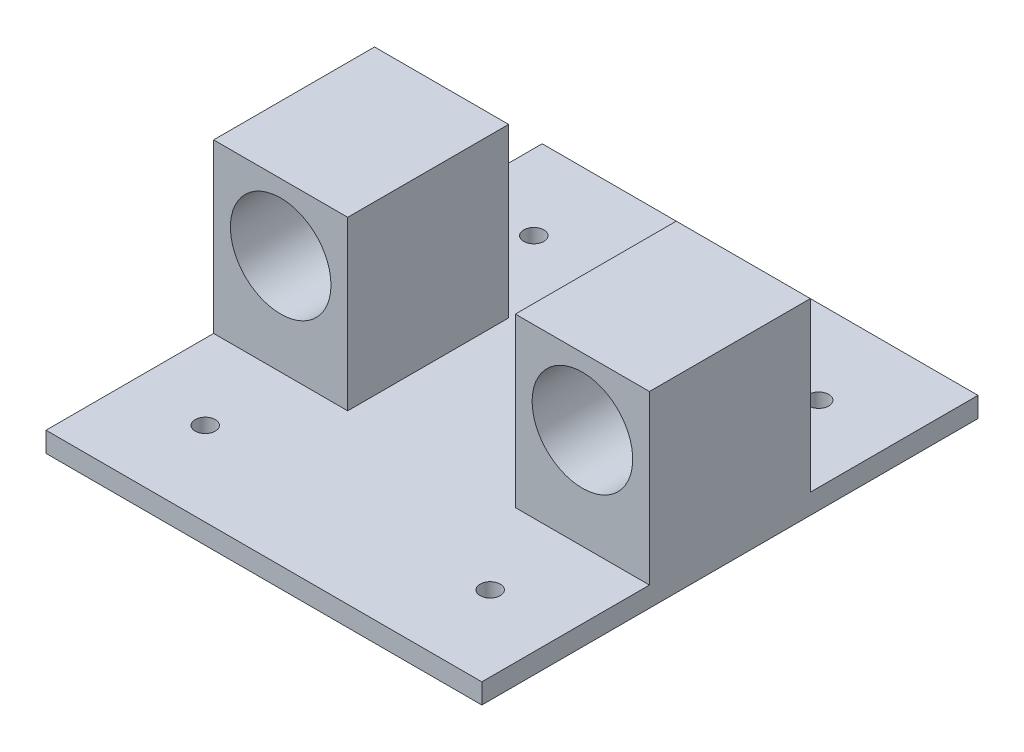
ISO-10303-21;
HEADER;
FILE_DESCRIPTION(('STEP AP214'),'2;1');
FILE_NAME('part.step','',(''),(''),'','','');
FILE_SCHEMA(('AUTOMOTIVE_DESIGN { 1 0 10303 214 1 1 1 1 }'));
ENDSEC;
DATA;
#1=APPLICATION_CONTEXT('core data for automotive mechanical design processes');
#2=APPLICATION_PROTOCOL_DEFINITION('international standard','automotive_design',2000,#1);
#3=PRODUCT_CONTEXT('',#1,'mechanical');
#4=PRODUCT('Part','Part','',(#3));
#5=PRODUCT_RELATED_PRODUCT_CATEGORY('part','',(#4));
#6=PRODUCT_DEFINITION_FORMATION('','',#4);
#7=PRODUCT_DEFINITION_CONTEXT('part definition',#1,'design');
#8=PRODUCT_DEFINITION('design','',#6,#7);
#9=PRODUCT_DEFINITION_SHAPE('','',#8);
#10=(LENGTH_UNIT() NAMED_UNIT(*) SI_UNIT(.MILLI.,.METRE.));
#11=(NAMED_UNIT(*) PLANE_ANGLE_UNIT() SI_UNIT($,.RADIAN.));
#12=(NAMED_UNIT(*) SI_UNIT($,.STERADIAN.) SOLID_ANGLE_UNIT());
#13=UNCERTAINTY_MEASURE_WITH_UNIT(LENGTH_MEASURE(1.E-05),#10,'distance_accuracy_value','');
#14=(GEOMETRIC_REPRESENTATION_CONTEXT(3) GLOBAL_UNCERTAINTY_ASSIGNED_CONTEXT((#13)) GLOBAL_UNIT_ASSIGNED_CONTEXT((#10,
#11,#12)) REPRESENTATION_CONTEXT('',''));
#15=CARTESIAN_POINT('',(0.,0.,0.));
#16=DIRECTION('',(0.,0.,1.));
#17=DIRECTION('',(1.,0.,0.));
#18=AXIS2_PLACEMENT_3D('',#15,#16,#17);
#19=CARTESIAN_POINT('',(0.,0.,-12.));
#20=DIRECTION('',(0.,0.,1.));
#21=DIRECTION('',(1.,0.,0.));
#22=AXIS2_PLACEMENT_3D('',#19,#20,#21);
#23=PLANE('',#22);
#24=CARTESIAN_POINT('',(22.5,18.,-12.));
#25=DIRECTION('',(0.,0.,-1.));
#26=DIRECTION('',(-1.,0.,0.));
#27=AXIS2_PLACEMENT_3D('',#24,#25,#26);
#28=CIRCLE('',#27,7.5);
#29=CARTESIAN_POINT('',(15.,18.,-12.));
#30=VERTEX_POINT('',#29);
#31=EDGE_CURVE('E208',#30,#30,#28,.T.);
#32=ORIENTED_EDGE('',*,*,#31,.F.);
#33=EDGE_LOOP('',(#32));
#34=FACE_BOUND('',#33,.T.);
#35=DIRECTION('',(0.,1.,0.));
#36=VECTOR('',#35,1.);
#37=CARTESIAN_POINT('',(32.5,0.,-12.));
#38=LINE('',#37,#36);
#39=CARTESIAN_POINT('',(32.5,3.,-12.));
#40=VERTEX_POINT('',#39);
#41=CARTESIAN_POINT('',(32.5,28.,-12.));
#42=VERTEX_POINT('',#41);
#43=EDGE_CURVE('E255',#40,#42,#38,.T.);
#44=ORIENTED_EDGE('',*,*,#43,.F.);
#45=DIRECTION('',(-1.,0.,0.));
#46=VECTOR('',#45,1.);
#47=CARTESIAN_POINT('',(32.5,3.,-12.));
#48=LINE('',#47,#46);
#49=CARTESIAN_POINT('',(12.5,3.,-12.));
#50=VERTEX_POINT('',#49);
#51=EDGE_CURVE('E51',#40,#50,#48,.T.);
#52=ORIENTED_EDGE('',*,*,#51,.T.);
#53=DIRECTION('',(0.,-1.,0.));
#54=VECTOR('',#53,1.);
#55=CARTESIAN_POINT('',(12.5,28.,-12.));
#56=LINE('',#55,#54);
#57=CARTESIAN_POINT('',(12.5,28.,-12.));
#58=VERTEX_POINT('',#57);
#59=EDGE_CURVE('E220',#58,#50,#56,.T.);
#60=ORIENTED_EDGE('',*,*,#59,.F.);
#61=DIRECTION('',(-1.,0.,0.));
#62=VECTOR('',#61,1.);
#63=CARTESIAN_POINT('',(32.5,28.,-12.));
#64=LINE('',#63,#62);
#65=EDGE_CURVE('E228',#42,#58,#64,.T.);
#66=ORIENTED_EDGE('',*,*,#65,.F.);
#67=EDGE_LOOP('',(#44,#52,#60,#66));
#68=FACE_BOUND('',#67,.T.);
#69=ADVANCED_FACE('F39',(#34,#68),#23,.F.);
#70=CARTESIAN_POINT('',(0.,0.,12.));
#71=DIRECTION('',(0.,0.,1.));
#72=DIRECTION('',(1.,0.,0.));
#73=AXIS2_PLACEMENT_3D('',#70,#71,#72);
#74=PLANE('',#73);
#75=DIRECTION('',(-1.,0.,0.));
#76=VECTOR('',#75,1.);
#77=CARTESIAN_POINT('',(32.5,3.,12.));
#78=LINE('',#77,#76);
#79=CARTESIAN_POINT('',(32.5,3.,12.));
#80=VERTEX_POINT('',#79);
#81=CARTESIAN_POINT('',(12.5,2.99999999999999,12.));
#82=VERTEX_POINT('',#81);
#83=EDGE_CURVE('E65',#80,#82,#78,.T.);
#84=ORIENTED_EDGE('',*,*,#83,.F.);
#85=DIRECTION('',(0.,1.,0.));
#86=VECTOR('',#85,1.);
#87=CARTESIAN_POINT('',(32.5,0.,12.));
#88=LINE('',#87,#86);
#89=CARTESIAN_POINT('',(32.5,28.,12.));
#90=VERTEX_POINT('',#89);
#91=EDGE_CURVE('E237',#80,#90,#88,.T.);
#92=ORIENTED_EDGE('',*,*,#91,.T.);
#93=DIRECTION('',(-1.,0.,0.));
#94=VECTOR('',#93,1.);
#95=CARTESIAN_POINT('',(32.5,28.,12.));
#96=LINE('',#95,#94);
#97=CARTESIAN_POINT('',(12.5,28.,12.));
#98=VERTEX_POINT('',#97);
#99=EDGE_CURVE('E240',#90,#98,#96,.T.);
#100=ORIENTED_EDGE('',*,*,#99,.T.);
#101=DIRECTION('',(0.,-1.,0.));
#102=VECTOR('',#101,1.);
#103=CARTESIAN_POINT('',(12.5,28.,12.));
#104=LINE('',#103,#102);
#105=EDGE_CURVE('E224',#98,#82,#104,.T.);
#106=ORIENTED_EDGE('',*,*,#105,.T.);
#107=EDGE_LOOP('',(#84,#92,#100,#106));
#108=FACE_BOUND('',#107,.T.);
#109=CARTESIAN_POINT('',(22.5,18.,12.));
#110=DIRECTION('',(0.,0.,-1.));
#111=DIRECTION('',(-1.,0.,0.));
#112=AXIS2_PLACEMENT_3D('',#109,#110,#111);
#113=CIRCLE('',#112,7.5);
#114=CARTESIAN_POINT('',(15.,18.,12.));
#115=VERTEX_POINT('',#114);
#116=EDGE_CURVE('E207',#115,#115,#113,.T.);
#117=ORIENTED_EDGE('',*,*,#116,.T.);
#118=EDGE_LOOP('',(#117));
#119=FACE_BOUND('',#118,.T.);
#120=ADVANCED_FACE('F304',(#108,#119),#74,.T.);
#121=CARTESIAN_POINT('',(12.5,28.,12.));
#122=DIRECTION('',(1.,0.,0.));
#123=DIRECTION('',(0.,1.,0.));
#124=AXIS2_PLACEMENT_3D('',#121,#122,#123);
#125=PLANE('',#124);
#126=ORIENTED_EDGE('',*,*,#59,.T.);
#127=DIRECTION('',(0.,0.,-1.));
#128=VECTOR('',#127,1.);
#129=CARTESIAN_POINT('',(12.5,2.99999999999999,12.));
#130=LINE('',#129,#128);
#131=EDGE_CURVE('E43',#82,#50,#130,.T.);
#132=ORIENTED_EDGE('',*,*,#131,.F.);
#133=ORIENTED_EDGE('',*,*,#105,.F.);
#134=DIRECTION('',(0.,0.,-1.));
#135=VECTOR('',#134,1.);
#136=CARTESIAN_POINT('',(12.5,28.,12.));
#137=LINE('',#136,#135);
#138=EDGE_CURVE('E243',#98,#58,#137,.T.);
#139=ORIENTED_EDGE('',*,*,#138,.T.);
#140=EDGE_LOOP('',(#126,#132,#133,#139));
#141=FACE_BOUND('',#140,.T.);
#142=ADVANCED_FACE('F41',(#141),#125,.F.);
#143=CARTESIAN_POINT('',(-12.5,2.99999999999999,12.));
#144=DIRECTION('',(0.,-1.,0.));
#145=DIRECTION('',(0.,0.,-1.));
#146=AXIS2_PLACEMENT_3D('',#143,#144,#145);
#147=PLANE('',#146);
#148=CARTESIAN_POINT('',(-21.25,2.99999999999999,-24.5));
#149=DIRECTION('',(0.,-1.,0.));
#150=DIRECTION('',(0.,0.,-1.));
#151=AXIS2_PLACEMENT_3D('',#148,#149,#150);
#152=CIRCLE('',#151,1.5);
#153=CARTESIAN_POINT('',(-21.25,3.,-23.));
#154=VERTEX_POINT('',#153);
#155=EDGE_CURVE('E165',#154,#154,#152,.F.);
#156=ORIENTED_EDGE('',*,*,#155,.F.);
#157=EDGE_LOOP('',(#156));
#158=FACE_BOUND('',#157,.T.);
#159=CARTESIAN_POINT('',(21.25,2.99999999999999,-24.5));
#160=DIRECTION('',(0.,-1.,0.));
#161=DIRECTION('',(0.,0.,-1.));
#162=AXIS2_PLACEMENT_3D('',#159,#160,#161);
#163=CIRCLE('',#162,1.5);
#164=CARTESIAN_POINT('',(21.25,3.,-23.));
#165=VERTEX_POINT('',#164);
#166=EDGE_CURVE('E378',#165,#165,#163,.F.);
#167=ORIENTED_EDGE('',*,*,#166,.F.);
#168=EDGE_LOOP('',(#167));
#169=FACE_BOUND('',#168,.T.);
#170=CARTESIAN_POINT('',(-21.25,2.99999999999999,24.5));
#171=DIRECTION('',(0.,-1.,0.));
#172=DIRECTION('',(0.,0.,-1.));
#173=AXIS2_PLACEMENT_3D('',#170,#171,#172);
#174=CIRCLE('',#173,1.5);
#175=CARTESIAN_POINT('',(-21.25,3.,26.));
#176=VERTEX_POINT('',#175);
#177=EDGE_CURVE('E179',#176,#176,#174,.T.);
#178=ORIENTED_EDGE('',*,*,#177,.T.);
#179=EDGE_LOOP('',(#178));
#180=FACE_BOUND('',#179,.T.);
#181=CARTESIAN_POINT('',(21.25,2.99999999999999,24.5));
#182=DIRECTION('',(0.,-1.,0.));
#183=DIRECTION('',(0.,0.,-1.));
#184=AXIS2_PLACEMENT_3D('',#181,#182,#183);
#185=CIRCLE('',#184,1.5);
#186=CARTESIAN_POINT('',(21.25,3.,26.));
#187=VERTEX_POINT('',#186);
#188=EDGE_CURVE('E172',#187,#187,#185,.T.);
#189=ORIENTED_EDGE('',*,*,#188,.T.);
#190=EDGE_LOOP('',(#189));
#191=FACE_BOUND('',#190,.T.);
#192=ORIENTED_EDGE('',*,*,#131,.T.);
#193=ORIENTED_EDGE('',*,*,#51,.F.);
#194=DIRECTION('',(0.,0.,1.));
#195=VECTOR('',#194,1.);
#196=CARTESIAN_POINT('',(32.5,3.,-37.));
#197=LINE('',#196,#195);
#198=CARTESIAN_POINT('',(32.5,3.,-37.));
#199=VERTEX_POINT('',#198);
#200=EDGE_CURVE('E140',#199,#40,#197,.T.);
#201=ORIENTED_EDGE('',*,*,#200,.F.);
#202=DIRECTION('',(-1.,0.,0.));
#203=VECTOR('',#202,1.);
#204=CARTESIAN_POINT('',(32.5,3.,-37.));
#205=LINE('',#204,#203);
#206=CARTESIAN_POINT('',(-32.5,2.99999999999999,-37.));
#207=VERTEX_POINT('',#206);
#208=EDGE_CURVE('E146',#199,#207,#205,.T.);
#209=ORIENTED_EDGE('',*,*,#208,.T.);
#210=DIRECTION('',(0.,0.,1.));
#211=VECTOR('',#210,1.);
#212=CARTESIAN_POINT('',(-32.5,2.99999999999999,-37.));
#213=LINE('',#212,#211);
#214=CARTESIAN_POINT('',(-32.5,3.,-12.));
#215=VERTEX_POINT('',#214);
#216=EDGE_CURVE('E58',#207,#215,#213,.T.);
#217=ORIENTED_EDGE('',*,*,#216,.T.);
#218=CARTESIAN_POINT('',(-12.5,2.99999999999999,-12.));
#219=VERTEX_POINT('',#218);
#220=EDGE_CURVE('E11',#219,#215,#48,.T.);
#221=ORIENTED_EDGE('',*,*,#220,.F.);
#222=DIRECTION('',(0.,0.,-1.));
#223=VECTOR('',#222,1.);
#224=CARTESIAN_POINT('',(-12.5,2.99999999999999,12.));
#225=LINE('',#224,#223);
#226=CARTESIAN_POINT('',(-12.5,2.99999999999999,12.));
#227=VERTEX_POINT('',#226);
#228=EDGE_CURVE('E279',#227,#219,#225,.T.);
#229=ORIENTED_EDGE('',*,*,#228,.F.);
#230=CARTESIAN_POINT('',(-32.5,2.99999999999999,12.));
#231=VERTEX_POINT('',#230);
#232=EDGE_CURVE('E49',#227,#231,#78,.T.);
#233=ORIENTED_EDGE('',*,*,#232,.T.);
#234=DIRECTION('',(0.,0.,-1.));
#235=VECTOR('',#234,1.);
#236=CARTESIAN_POINT('',(-32.5,2.99999999999999,37.));
#237=LINE('',#236,#235);
#238=CARTESIAN_POINT('',(-32.5,2.99999999999999,37.));
#239=VERTEX_POINT('',#238);
#240=EDGE_CURVE('E197',#239,#231,#237,.T.);
#241=ORIENTED_EDGE('',*,*,#240,.F.);
#242=DIRECTION('',(-1.,0.,0.));
#243=VECTOR('',#242,1.);
#244=CARTESIAN_POINT('',(32.5,3.,37.));
#245=LINE('',#244,#243);
#246=CARTESIAN_POINT('',(32.5,3.,37.));
#247=VERTEX_POINT('',#246);
#248=EDGE_CURVE('E194',#247,#239,#245,.T.);
#249=ORIENTED_EDGE('',*,*,#248,.F.);
#250=DIRECTION('',(0.,0.,-1.));
#251=VECTOR('',#250,1.);
#252=CARTESIAN_POINT('',(32.5,3.,37.));
#253=LINE('',#252,#251);
#254=EDGE_CURVE('E203',#247,#80,#253,.T.);
#255=ORIENTED_EDGE('',*,*,#254,.T.);
#256=ORIENTED_EDGE('',*,*,#83,.T.);
#257=EDGE_LOOP('',(#192,#193,#201,#209,#217,#221,#229,#233,#241,#249,#255,#256));
#258=FACE_BOUND('',#257,.T.);
#259=ADVANCED_FACE('F153',(#158,#169,#180,#191,#258),#147,.F.);
#260=CARTESIAN_POINT('',(-12.5,28.,12.));
#261=DIRECTION('',(-1.,0.,0.));
#262=DIRECTION('',(0.,-1.,0.));
#263=AXIS2_PLACEMENT_3D('',#260,#261,#262);
#264=PLANE('',#263);
#265=DIRECTION('',(0.,1.,0.));
#266=VECTOR('',#265,1.);
#267=CARTESIAN_POINT('',(-12.5,28.,-12.));
#268=LINE('',#267,#266);
#269=CARTESIAN_POINT('',(-12.5,28.,-12.));
#270=VERTEX_POINT('',#269);
#271=EDGE_CURVE('E247',#219,#270,#268,.T.);
#272=ORIENTED_EDGE('',*,*,#271,.T.);
#273=DIRECTION('',(0.,0.,-1.));
#274=VECTOR('',#273,1.);
#275=CARTESIAN_POINT('',(-12.5,28.,12.));
#276=LINE('',#275,#274);
#277=CARTESIAN_POINT('',(-12.5,28.,12.));
#278=VERTEX_POINT('',#277);
#279=EDGE_CURVE('E276',#278,#270,#276,.T.);
#280=ORIENTED_EDGE('',*,*,#279,.F.);
#281=DIRECTION('',(0.,1.,0.));
#282=VECTOR('',#281,1.);
#283=CARTESIAN_POINT('',(-12.5,28.,12.));
#284=LINE('',#283,#282);
#285=EDGE_CURVE('E227',#227,#278,#284,.T.);
#286=ORIENTED_EDGE('',*,*,#285,.F.);
#287=ORIENTED_EDGE('',*,*,#228,.T.);
#288=EDGE_LOOP('',(#272,#280,#286,#287));
#289=FACE_BOUND('',#288,.T.);
#290=ADVANCED_FACE('F354',(#289),#264,.F.);
#291=CARTESIAN_POINT('',(-32.5,28.,12.));
#292=DIRECTION('',(0.,-1.,0.));
#293=DIRECTION('',(0.,0.,-1.));
#294=AXIS2_PLACEMENT_3D('',#291,#292,#293);
#295=PLANE('',#294);
#296=DIRECTION('',(-1.,0.,0.));
#297=VECTOR('',#296,1.);
#298=CARTESIAN_POINT('',(-32.5,28.,-12.));
#299=LINE('',#298,#297);
#300=CARTESIAN_POINT('',(-32.5,28.,-12.));
#301=VERTEX_POINT('',#300);
#302=EDGE_CURVE('E250',#270,#301,#299,.T.);
#303=ORIENTED_EDGE('',*,*,#302,.T.);
#304=DIRECTION('',(0.,0.,-1.));
#305=VECTOR('',#304,1.);
#306=CARTESIAN_POINT('',(-32.5,28.,12.));
#307=LINE('',#306,#305);
#308=CARTESIAN_POINT('',(-32.5,28.,12.));
#309=VERTEX_POINT('',#308);
#310=EDGE_CURVE('E273',#309,#301,#307,.T.);
#311=ORIENTED_EDGE('',*,*,#310,.F.);
#312=DIRECTION('',(-1.,0.,0.));
#313=VECTOR('',#312,1.);
#314=CARTESIAN_POINT('',(-32.5,28.,12.));
#315=LINE('',#314,#313);
#316=EDGE_CURVE('E231',#278,#309,#315,.T.);
#317=ORIENTED_EDGE('',*,*,#316,.F.);
#318=ORIENTED_EDGE('',*,*,#279,.T.);
#319=EDGE_LOOP('',(#303,#311,#317,#318));
#320=FACE_BOUND('',#319,.T.);
#321=ADVANCED_FACE('F325',(#320),#295,.F.);
#322=CARTESIAN_POINT('',(-32.5,0.,12.));
#323=DIRECTION('',(1.,0.,0.));
#324=DIRECTION('',(0.,0.,-1.));
#325=AXIS2_PLACEMENT_3D('',#322,#323,#324);
#326=PLANE('',#325);
#327=DIRECTION('',(0.,-1.,0.));
#328=VECTOR('',#327,1.);
#329=CARTESIAN_POINT('',(-32.5,0.,-12.));
#330=LINE('',#329,#328);
#331=EDGE_CURVE('E137',#301,#215,#330,.T.);
#332=ORIENTED_EDGE('',*,*,#331,.T.);
#333=ORIENTED_EDGE('',*,*,#216,.F.);
#334=DIRECTION('',(0.,-1.,0.));
#335=VECTOR('',#334,1.);
#336=CARTESIAN_POINT('',(-32.5,2.99999999999999,-37.));
#337=LINE('',#336,#335);
#338=CARTESIAN_POINT('',(-32.5,0.,-37.));
#339=VERTEX_POINT('',#338);
#340=EDGE_CURVE('E133',#207,#339,#337,.T.);
#341=ORIENTED_EDGE('',*,*,#340,.T.);
#342=DIRECTION('',(0.,0.,-1.));
#343=VECTOR('',#342,1.);
#344=CARTESIAN_POINT('',(-32.5,0.,12.));
#345=LINE('',#344,#343);
#346=CARTESIAN_POINT('',(-32.5,0.,37.));
#347=VERTEX_POINT('',#346);
#348=EDGE_CURVE('E270',#347,#339,#345,.T.);
#349=ORIENTED_EDGE('',*,*,#348,.F.);
#350=DIRECTION('',(0.,-1.,0.));
#351=VECTOR('',#350,1.);
#352=CARTESIAN_POINT('',(-32.5,2.99999999999999,37.));
#353=LINE('',#352,#351);
#354=EDGE_CURVE('E183',#239,#347,#353,.T.);
#355=ORIENTED_EDGE('',*,*,#354,.F.);
#356=ORIENTED_EDGE('',*,*,#240,.T.);
#357=DIRECTION('',(0.,-1.,0.));
#358=VECTOR('',#357,1.);
#359=CARTESIAN_POINT('',(-32.5,0.,12.));
#360=LINE('',#359,#358);
#361=EDGE_CURVE('E234',#309,#231,#360,.T.);
#362=ORIENTED_EDGE('',*,*,#361,.F.);
#363=ORIENTED_EDGE('',*,*,#310,.T.);
#364=EDGE_LOOP('',(#332,#333,#341,#349,#355,#356,#362,#363));
#365=FACE_BOUND('',#364,.T.);
#366=ADVANCED_FACE('F132',(#365),#326,.F.);
#367=CARTESIAN_POINT('',(32.5,0.,12.));
#368=DIRECTION('',(0.,1.,0.));
#369=DIRECTION('',(0.,0.,1.));
#370=AXIS2_PLACEMENT_3D('',#367,#368,#369);
#371=PLANE('',#370);
#372=CARTESIAN_POINT('',(-21.25,0.,-24.5));
#373=DIRECTION('',(0.,-1.,0.));
#374=DIRECTION('',(0.,0.,-1.));
#375=AXIS2_PLACEMENT_3D('',#372,#373,#374);
#376=CIRCLE('',#375,1.5);
#377=CARTESIAN_POINT('',(-21.25,0.,-23.));
#378=VERTEX_POINT('',#377);
#379=EDGE_CURVE('E505',#378,#378,#376,.T.);
#380=ORIENTED_EDGE('',*,*,#379,.F.);
#381=EDGE_LOOP('',(#380));
#382=FACE_BOUND('',#381,.T.);
#383=CARTESIAN_POINT('',(21.25,0.,-24.5));
#384=DIRECTION('',(0.,-1.,0.));
#385=DIRECTION('',(0.,0.,1.));
#386=AXIS2_PLACEMENT_3D('',#383,#384,#385);
#387=CIRCLE('',#386,1.5);
#388=CARTESIAN_POINT('',(21.25,0.,-23.));
#389=VERTEX_POINT('',#388);
#390=EDGE_CURVE('E510',#389,#389,#387,.T.);
#391=ORIENTED_EDGE('',*,*,#390,.F.);
#392=EDGE_LOOP('',(#391));
#393=FACE_BOUND('',#392,.T.);
#394=CARTESIAN_POINT('',(-21.25,0.,24.5));
#395=DIRECTION('',(0.,1.,0.));
#396=DIRECTION('',(0.,0.,1.));
#397=AXIS2_PLACEMENT_3D('',#394,#395,#396);
#398=CIRCLE('',#397,1.5);
#399=CARTESIAN_POINT('',(-21.25,0.,26.));
#400=VERTEX_POINT('',#399);
#401=EDGE_CURVE('E168',#400,#400,#398,.T.);
#402=ORIENTED_EDGE('',*,*,#401,.T.);
#403=EDGE_LOOP('',(#402));
#404=FACE_BOUND('',#403,.T.);
#405=CARTESIAN_POINT('',(21.25,0.,24.5));
#406=DIRECTION('',(0.,1.,0.));
#407=DIRECTION('',(0.,0.,-1.));
#408=AXIS2_PLACEMENT_3D('',#405,#406,#407);
#409=CIRCLE('',#408,1.5);
#410=CARTESIAN_POINT('',(21.25,0.,26.));
#411=VERTEX_POINT('',#410);
#412=EDGE_CURVE('E139',#411,#411,#409,.T.);
#413=ORIENTED_EDGE('',*,*,#412,.T.);
#414=EDGE_LOOP('',(#413));
#415=FACE_BOUND('',#414,.T.);
#416=ORIENTED_EDGE('',*,*,#348,.T.);
#417=DIRECTION('',(1.,0.,0.));
#418=VECTOR('',#417,1.);
#419=CARTESIAN_POINT('',(-32.5,0.,-37.));
#420=LINE('',#419,#418);
#421=CARTESIAN_POINT('',(32.5,0.,-37.));
#422=VERTEX_POINT('',#421);
#423=EDGE_CURVE('E149',#339,#422,#420,.T.);
#424=ORIENTED_EDGE('',*,*,#423,.T.);
#425=DIRECTION('',(0.,0.,-1.));
#426=VECTOR('',#425,1.);
#427=CARTESIAN_POINT('',(32.5,0.,12.));
#428=LINE('',#427,#426);
#429=CARTESIAN_POINT('',(32.5,0.,37.));
#430=VERTEX_POINT('',#429);
#431=EDGE_CURVE('E267',#430,#422,#428,.T.);
#432=ORIENTED_EDGE('',*,*,#431,.F.);
#433=DIRECTION('',(1.,0.,0.));
#434=VECTOR('',#433,1.);
#435=CARTESIAN_POINT('',(-32.5,0.,37.));
#436=LINE('',#435,#434);
#437=EDGE_CURVE('E187',#347,#430,#436,.T.);
#438=ORIENTED_EDGE('',*,*,#437,.F.);
#439=EDGE_LOOP('',(#416,#424,#432,#438));
#440=FACE_BOUND('',#439,.T.);
#441=ADVANCED_FACE('F316',(#382,#393,#404,#415,#440),#371,.F.);
#442=CARTESIAN_POINT('',(32.5,0.,12.));
#443=DIRECTION('',(-1.,0.,0.));
#444=DIRECTION('',(0.,0.,1.));
#445=AXIS2_PLACEMENT_3D('',#442,#443,#444);
#446=PLANE('',#445);
#447=ORIENTED_EDGE('',*,*,#431,.T.);
#448=DIRECTION('',(0.,1.,0.));
#449=VECTOR('',#448,1.);
#450=CARTESIAN_POINT('',(32.5,0.,-37.));
#451=LINE('',#450,#449);
#452=EDGE_CURVE('E156',#422,#199,#451,.T.);
#453=ORIENTED_EDGE('',*,*,#452,.T.);
#454=ORIENTED_EDGE('',*,*,#200,.T.);
#455=ORIENTED_EDGE('',*,*,#43,.T.);
#456=DIRECTION('',(0.,0.,-1.));
#457=VECTOR('',#456,1.);
#458=CARTESIAN_POINT('',(32.5,28.,12.));
#459=LINE('',#458,#457);
#460=EDGE_CURVE('E263',#90,#42,#459,.T.);
#461=ORIENTED_EDGE('',*,*,#460,.F.);
#462=ORIENTED_EDGE('',*,*,#91,.F.);
#463=ORIENTED_EDGE('',*,*,#254,.F.);
#464=DIRECTION('',(0.,1.,0.));
#465=VECTOR('',#464,1.);
#466=CARTESIAN_POINT('',(32.5,0.,37.));
#467=LINE('',#466,#465);
#468=EDGE_CURVE('E191',#430,#247,#467,.T.);
#469=ORIENTED_EDGE('',*,*,#468,.F.);
#470=EDGE_LOOP('',(#447,#453,#454,#455,#461,#462,#463,#469));
#471=FACE_BOUND('',#470,.T.);
#472=ADVANCED_FACE('F301',(#471),#446,.F.);
#473=CARTESIAN_POINT('',(32.5,28.,12.));
#474=DIRECTION('',(0.,-1.,0.));
#475=DIRECTION('',(0.,0.,-1.));
#476=AXIS2_PLACEMENT_3D('',#473,#474,#475);
#477=PLANE('',#476);
#478=ORIENTED_EDGE('',*,*,#65,.T.);
#479=ORIENTED_EDGE('',*,*,#138,.F.);
#480=ORIENTED_EDGE('',*,*,#99,.F.);
#481=ORIENTED_EDGE('',*,*,#460,.T.);
#482=EDGE_LOOP('',(#478,#479,#480,#481));
#483=FACE_BOUND('',#482,.T.);
#484=ADVANCED_FACE('F309',(#483),#477,.F.);
#485=ORIENTED_EDGE('',*,*,#232,.F.);
#486=ORIENTED_EDGE('',*,*,#285,.T.);
#487=ORIENTED_EDGE('',*,*,#316,.T.);
#488=ORIENTED_EDGE('',*,*,#361,.T.);
#489=EDGE_LOOP('',(#485,#486,#487,#488));
#490=FACE_BOUND('',#489,.T.);
#491=CARTESIAN_POINT('',(-22.5,18.,12.));
#492=DIRECTION('',(0.,0.,1.));
#493=DIRECTION('',(1.,0.,0.));
#494=AXIS2_PLACEMENT_3D('',#491,#492,#493);
#495=CIRCLE('',#494,7.5);
#496=CARTESIAN_POINT('',(-15.,18.,12.));
#497=VERTEX_POINT('',#496);
#498=EDGE_CURVE('E212',#497,#497,#495,.T.);
#499=ORIENTED_EDGE('',*,*,#498,.F.);
#500=EDGE_LOOP('',(#499));
#501=FACE_BOUND('',#500,.T.);
#502=ADVANCED_FACE('F337',(#490,#501),#74,.T.);
#503=CARTESIAN_POINT('',(-22.5,18.,-12.));
#504=DIRECTION('',(0.,0.,1.));
#505=DIRECTION('',(1.,0.,0.));
#506=AXIS2_PLACEMENT_3D('',#503,#504,#505);
#507=CIRCLE('',#506,7.5);
#508=CARTESIAN_POINT('',(-15.,18.,-12.));
#509=VERTEX_POINT('',#508);
#510=EDGE_CURVE('E216',#509,#509,#507,.T.);
#511=ORIENTED_EDGE('',*,*,#510,.T.);
#512=EDGE_LOOP('',(#511));
#513=FACE_BOUND('',#512,.T.);
#514=ORIENTED_EDGE('',*,*,#271,.F.);
#515=ORIENTED_EDGE('',*,*,#220,.T.);
#516=ORIENTED_EDGE('',*,*,#331,.F.);
#517=ORIENTED_EDGE('',*,*,#302,.F.);
#518=EDGE_LOOP('',(#514,#515,#516,#517));
#519=FACE_BOUND('',#518,.T.);
#520=ADVANCED_FACE('F332',(#513,#519),#23,.F.);
#521=CARTESIAN_POINT('',(-22.5,18.,-12.));
#522=DIRECTION('',(0.,0.,1.));
#523=DIRECTION('',(1.,0.,0.));
#524=AXIS2_PLACEMENT_3D('',#521,#522,#523);
#525=CYLINDRICAL_SURFACE('',#524,7.5);
#526=ORIENTED_EDGE('',*,*,#510,.F.);
#527=EDGE_LOOP('',(#526));
#528=FACE_BOUND('',#527,.T.);
#529=ORIENTED_EDGE('',*,*,#498,.T.);
#530=EDGE_LOOP('',(#529));
#531=FACE_BOUND('',#530,.T.);
#532=ADVANCED_FACE('F341',(#528,#531),#525,.F.);
#533=CARTESIAN_POINT('',(22.5,18.,-12.));
#534=DIRECTION('',(0.,0.,1.));
#535=DIRECTION('',(1.,0.,0.));
#536=AXIS2_PLACEMENT_3D('',#533,#534,#535);
#537=CYLINDRICAL_SURFACE('',#536,7.5);
#538=ORIENTED_EDGE('',*,*,#31,.T.);
#539=EDGE_LOOP('',(#538));
#540=FACE_BOUND('',#539,.T.);
#541=ORIENTED_EDGE('',*,*,#116,.F.);
#542=EDGE_LOOP('',(#541));
#543=FACE_BOUND('',#542,.T.);
#544=ADVANCED_FACE('F347',(#540,#543),#537,.F.);
#545=CARTESIAN_POINT('',(0.,0.,37.));
#546=DIRECTION('',(0.,0.,1.));
#547=DIRECTION('',(1.,0.,0.));
#548=AXIS2_PLACEMENT_3D('',#545,#546,#547);
#549=PLANE('',#548);
#550=ORIENTED_EDGE('',*,*,#354,.T.);
#551=ORIENTED_EDGE('',*,*,#437,.T.);
#552=ORIENTED_EDGE('',*,*,#468,.T.);
#553=ORIENTED_EDGE('',*,*,#248,.T.);
#554=EDGE_LOOP('',(#550,#551,#552,#553));
#555=FACE_BOUND('',#554,.T.);
#556=ADVANCED_FACE('F297',(#555),#549,.T.);
#557=CARTESIAN_POINT('',(21.25,0.,24.5));
#558=DIRECTION('',(0.,1.,0.));
#559=DIRECTION('',(0.,0.,1.));
#560=AXIS2_PLACEMENT_3D('',#557,#558,#559);
#561=CYLINDRICAL_SURFACE('',#560,1.5);
#562=CARTESIAN_POINT('',(21.25,0.,26.));
#563=CARTESIAN_POINT('',(21.25,0.0312499999999914,26.));
#564=CARTESIAN_POINT('',(21.25,0.0624999999999914,26.));
#565=CARTESIAN_POINT('',(21.25,0.124999999999991,26.));
#566=CARTESIAN_POINT('',(21.25,0.156249999999992,26.));
#567=CARTESIAN_POINT('',(21.25,0.218749999999992,26.));
#568=CARTESIAN_POINT('',(21.25,0.249999999999992,26.));
#569=CARTESIAN_POINT('',(21.25,0.312499999999992,26.));
#570=CARTESIAN_POINT('',(21.25,0.343749999999992,26.));
#571=CARTESIAN_POINT('',(21.25,0.406249999999992,26.));
#572=CARTESIAN_POINT('',(21.25,0.437499999999992,26.));
#573=CARTESIAN_POINT('',(21.25,0.499999999999992,26.));
#574=CARTESIAN_POINT('',(21.25,0.531249999999992,26.));
#575=CARTESIAN_POINT('',(21.25,0.593749999999992,26.));
#576=CARTESIAN_POINT('',(21.25,0.624999999999992,26.));
#577=CARTESIAN_POINT('',(21.25,0.687499999999992,26.));
#578=CARTESIAN_POINT('',(21.25,0.718749999999992,26.));
#579=CARTESIAN_POINT('',(21.25,0.781249999999992,26.));
#580=CARTESIAN_POINT('',(21.25,0.812499999999992,26.));
#581=CARTESIAN_POINT('',(21.25,0.874999999999992,26.));
#582=CARTESIAN_POINT('',(21.25,0.906249999999993,26.));
#583=CARTESIAN_POINT('',(21.25,0.968749999999993,26.));
#584=CARTESIAN_POINT('',(21.25,0.999999999999993,26.));
#585=CARTESIAN_POINT('',(21.25,1.06249999999999,26.));
#586=CARTESIAN_POINT('',(21.25,1.09374999999999,26.));
#587=CARTESIAN_POINT('',(21.25,1.15624999999999,26.));
#588=CARTESIAN_POINT('',(21.25,1.18749999999999,26.));
#589=CARTESIAN_POINT('',(21.25,1.24999999999999,26.));
#590=CARTESIAN_POINT('',(21.25,1.28124999999999,26.));
#591=CARTESIAN_POINT('',(21.25,1.34374999999999,26.));
#592=CARTESIAN_POINT('',(21.25,1.37499999999999,26.));
#593=CARTESIAN_POINT('',(21.25,1.43749999999999,26.));
#594=CARTESIAN_POINT('',(21.25,1.46874999999999,26.));
#595=CARTESIAN_POINT('',(21.25,1.53124999999999,26.));
#596=CARTESIAN_POINT('',(21.25,1.56249999999999,26.));
#597=CARTESIAN_POINT('',(21.25,1.62499999999999,26.));
#598=CARTESIAN_POINT('',(21.25,1.65624999999999,26.));
#599=CARTESIAN_POINT('',(21.25,1.71874999999999,26.));
#600=CARTESIAN_POINT('',(21.25,1.74999999999999,26.));
#601=CARTESIAN_POINT('',(21.25,1.81249999999999,26.));
#602=CARTESIAN_POINT('',(21.25,1.84374999999999,26.));
#603=CARTESIAN_POINT('',(21.25,1.90624999999999,26.));
#604=CARTESIAN_POINT('',(21.25,1.93749999999999,26.));
#605=CARTESIAN_POINT('',(21.25,1.99999999999999,26.));
#606=CARTESIAN_POINT('',(21.25,2.03124999999999,26.));
#607=CARTESIAN_POINT('',(21.25,2.09374999999999,26.));
#608=CARTESIAN_POINT('',(21.25,2.12499999999999,26.));
#609=CARTESIAN_POINT('',(21.25,2.18749999999999,26.));
#610=CARTESIAN_POINT('',(21.25,2.21874999999999,26.));
#611=CARTESIAN_POINT('',(21.25,2.28124999999999,26.));
#612=CARTESIAN_POINT('',(21.25,2.31249999999999,26.));
#613=CARTESIAN_POINT('',(21.25,2.37499999999999,26.));
#614=CARTESIAN_POINT('',(21.25,2.40624999999999,26.));
#615=CARTESIAN_POINT('',(21.25,2.46874999999999,26.));
#616=CARTESIAN_POINT('',(21.25,2.49999999999999,26.));
#617=CARTESIAN_POINT('',(21.25,2.56249999999999,26.));
#618=CARTESIAN_POINT('',(21.25,2.59375,26.));
#619=CARTESIAN_POINT('',(21.25,2.65625,26.));
#620=CARTESIAN_POINT('',(21.25,2.6875,26.));
#621=CARTESIAN_POINT('',(21.25,2.75,26.));
#622=CARTESIAN_POINT('',(21.25,2.78125,26.));
#623=CARTESIAN_POINT('',(21.25,2.84375,26.));
#624=CARTESIAN_POINT('',(21.25,2.875,26.));
#625=CARTESIAN_POINT('',(21.25,2.9375,26.));
#626=CARTESIAN_POINT('',(21.25,2.96875,26.));
#627=CARTESIAN_POINT('',(21.25,3.,26.));
#628=B_SPLINE_CURVE_WITH_KNOTS('',3,(#562,#563,#564,#565,#566,#567,#568,#569,#570,#571,#572,
#573,#574,#575,#576,#577,#578,#579,#580,#581,#582,#583,#584,#585,#586,#587,#588,#589,#590,#591,
#592,#593,#594,#595,#596,#597,#598,#599,#600,#601,#602,#603,#604,#605,#606,#607,#608,#609,#610,
#611,#612,#613,#614,#615,#616,#617,#618,#619,#620,#621,#622,#623,#624,#625,#626,#627),
.UNSPECIFIED.,.F.,.F.,(4,2,2,2,2,2,2,2,2,2,2,2,2,2,2,2,2,2,2,2,2,2,2,2,2,2,2,2,2,2,2,2,4),(0.,
0.0937500000000001,0.1875,0.28125,0.375,0.468750000000001,0.562500000000001,0.656250000000001,
0.750000000000001,0.843750000000001,0.937500000000001,1.03125,1.125,1.21875,1.3125,1.40625,1.5,
1.59375,1.6875,1.78125,1.875,1.96875,2.0625,2.15625,2.25,2.34375,2.4375,2.53125,2.625,2.71875,
2.8125,2.90625,3.),.UNSPECIFIED.);
#629=EDGE_CURVE('BSEAM383',#411,#187,#628,.T.);
#630=ORIENTED_EDGE('',*,*,#412,.F.);
#631=ORIENTED_EDGE('',*,*,#188,.F.);
#632=ORIENTED_EDGE('',*,*,#629,.T.);
#633=ORIENTED_EDGE('',*,*,#629,.F.);
#634=EDGE_LOOP('',(#630,#632,#631,#633));
#635=FACE_BOUND('',#634,.T.);
#636=ADVANCED_FACE('F383',(#635),#561,.F.);
#637=CARTESIAN_POINT('',(-21.25,0.,24.5));
#638=DIRECTION('',(0.,1.,0.));
#639=DIRECTION('',(0.,0.,1.));
#640=AXIS2_PLACEMENT_3D('',#637,#638,#639);
#641=CYLINDRICAL_SURFACE('',#640,1.5);
#642=CARTESIAN_POINT('',(-21.25,0.,26.));
#643=CARTESIAN_POINT('',(-21.25,0.0312499999999914,26.));
#644=CARTESIAN_POINT('',(-21.25,0.0624999999999914,26.));
#645=CARTESIAN_POINT('',(-21.25,0.124999999999991,26.));
#646=CARTESIAN_POINT('',(-21.25,0.156249999999992,26.));
#647=CARTESIAN_POINT('',(-21.25,0.218749999999992,26.));
#648=CARTESIAN_POINT('',(-21.25,0.249999999999992,26.));
#649=CARTESIAN_POINT('',(-21.25,0.312499999999992,26.));
#650=CARTESIAN_POINT('',(-21.25,0.343749999999992,26.));
#651=CARTESIAN_POINT('',(-21.25,0.406249999999992,26.));
#652=CARTESIAN_POINT('',(-21.25,0.437499999999992,26.));
#653=CARTESIAN_POINT('',(-21.25,0.499999999999992,26.));
#654=CARTESIAN_POINT('',(-21.25,0.531249999999992,26.));
#655=CARTESIAN_POINT('',(-21.25,0.593749999999992,26.));
#656=CARTESIAN_POINT('',(-21.25,0.624999999999992,26.));
#657=CARTESIAN_POINT('',(-21.25,0.687499999999992,26.));
#658=CARTESIAN_POINT('',(-21.25,0.718749999999992,26.));
#659=CARTESIAN_POINT('',(-21.25,0.781249999999992,26.));
#660=CARTESIAN_POINT('',(-21.25,0.812499999999992,26.));
#661=CARTESIAN_POINT('',(-21.25,0.874999999999992,26.));
#662=CARTESIAN_POINT('',(-21.25,0.906249999999993,26.));
#663=CARTESIAN_POINT('',(-21.25,0.968749999999993,26.));
#664=CARTESIAN_POINT('',(-21.25,0.999999999999993,26.));
#665=CARTESIAN_POINT('',(-21.25,1.06249999999999,26.));
#666=CARTESIAN_POINT('',(-21.25,1.09374999999999,26.));
#667=CARTESIAN_POINT('',(-21.25,1.15624999999999,26.));
#668=CARTESIAN_POINT('',(-21.25,1.18749999999999,26.));
#669=CARTESIAN_POINT('',(-21.25,1.24999999999999,26.));
#670=CARTESIAN_POINT('',(-21.25,1.28124999999999,26.));
#671=CARTESIAN_POINT('',(-21.25,1.34374999999999,26.));
#672=CARTESIAN_POINT('',(-21.25,1.37499999999999,26.));
#673=CARTESIAN_POINT('',(-21.25,1.43749999999999,26.));
#674=CARTESIAN_POINT('',(-21.25,1.46874999999999,26.));
#675=CARTESIAN_POINT('',(-21.25,1.53124999999999,26.));
#676=CARTESIAN_POINT('',(-21.25,1.56249999999999,26.));
#677=CARTESIAN_POINT('',(-21.25,1.62499999999999,26.));
#678=CARTESIAN_POINT('',(-21.25,1.65624999999999,26.));
#679=CARTESIAN_POINT('',(-21.25,1.71874999999999,26.));
#680=CARTESIAN_POINT('',(-21.25,1.74999999999999,26.));
#681=CARTESIAN_POINT('',(-21.25,1.81249999999999,26.));
#682=CARTESIAN_POINT('',(-21.25,1.84374999999999,26.));
#683=CARTESIAN_POINT('',(-21.25,1.90624999999999,26.));
#684=CARTESIAN_POINT('',(-21.25,1.93749999999999,26.));
#685=CARTESIAN_POINT('',(-21.25,1.99999999999999,26.));
#686=CARTESIAN_POINT('',(-21.25,2.03124999999999,26.));
#687=CARTESIAN_POINT('',(-21.25,2.09374999999999,26.));
#688=CARTESIAN_POINT('',(-21.25,2.12499999999999,26.));
#689=CARTESIAN_POINT('',(-21.25,2.18749999999999,26.));
#690=CARTESIAN_POINT('',(-21.25,2.21874999999999,26.));
#691=CARTESIAN_POINT('',(-21.25,2.28124999999999,26.));
#692=CARTESIAN_POINT('',(-21.25,2.31249999999999,26.));
#693=CARTESIAN_POINT('',(-21.25,2.37499999999999,26.));
#694=CARTESIAN_POINT('',(-21.25,2.40624999999999,26.));
#695=CARTESIAN_POINT('',(-21.25,2.46874999999999,26.));
#696=CARTESIAN_POINT('',(-21.25,2.49999999999999,26.));
#697=CARTESIAN_POINT('',(-21.25,2.56249999999999,26.));
#698=CARTESIAN_POINT('',(-21.25,2.59375,26.));
#699=CARTESIAN_POINT('',(-21.25,2.65625,26.));
#700=CARTESIAN_POINT('',(-21.25,2.6875,26.));
#701=CARTESIAN_POINT('',(-21.25,2.75,26.));
#702=CARTESIAN_POINT('',(-21.25,2.78125,26.));
#703=CARTESIAN_POINT('',(-21.25,2.84375,26.));
#704=CARTESIAN_POINT('',(-21.25,2.875,26.));
#705=CARTESIAN_POINT('',(-21.25,2.9375,26.));
#706=CARTESIAN_POINT('',(-21.25,2.96875,26.));
#707=CARTESIAN_POINT('',(-21.25,3.,26.));
#708=B_SPLINE_CURVE_WITH_KNOTS('',3,(#642,#643,#644,#645,#646,#647,#648,#649,#650,#651,#652,
#653,#654,#655,#656,#657,#658,#659,#660,#661,#662,#663,#664,#665,#666,#667,#668,#669,#670,#671,
#672,#673,#674,#675,#676,#677,#678,#679,#680,#681,#682,#683,#684,#685,#686,#687,#688,#689,#690,
#691,#692,#693,#694,#695,#696,#697,#698,#699,#700,#701,#702,#703,#704,#705,#706,#707),
.UNSPECIFIED.,.F.,.F.,(4,2,2,2,2,2,2,2,2,2,2,2,2,2,2,2,2,2,2,2,2,2,2,2,2,2,2,2,2,2,2,2,4),(0.,
0.0937500000000001,0.1875,0.28125,0.375,0.468750000000001,0.562500000000001,0.656250000000001,
0.750000000000001,0.843750000000001,0.937500000000001,1.03125,1.125,1.21875,1.3125,1.40625,1.5,
1.59375,1.6875,1.78125,1.875,1.96875,2.0625,2.15625,2.25,2.34375,2.4375,2.53125,2.625,2.71875,
2.8125,2.90625,3.),.UNSPECIFIED.);
#709=EDGE_CURVE('BSEAM385',#400,#176,#708,.T.);
#710=ORIENTED_EDGE('',*,*,#401,.F.);
#711=ORIENTED_EDGE('',*,*,#177,.F.);
#712=ORIENTED_EDGE('',*,*,#709,.T.);
#713=ORIENTED_EDGE('',*,*,#709,.F.);
#714=EDGE_LOOP('',(#710,#712,#711,#713));
#715=FACE_BOUND('',#714,.T.);
#716=ADVANCED_FACE('F385',(#715),#641,.F.);
#717=CARTESIAN_POINT('',(0.,0.,-37.));
#718=DIRECTION('',(0.,0.,-1.));
#719=DIRECTION('',(1.,0.,0.));
#720=AXIS2_PLACEMENT_3D('',#717,#718,#719);
#721=PLANE('',#720);
#722=ORIENTED_EDGE('',*,*,#340,.F.);
#723=ORIENTED_EDGE('',*,*,#208,.F.);
#724=ORIENTED_EDGE('',*,*,#452,.F.);
#725=ORIENTED_EDGE('',*,*,#423,.F.);
#726=EDGE_LOOP('',(#722,#723,#724,#725));
#727=FACE_BOUND('',#726,.T.);
#728=ADVANCED_FACE('F144',(#727),#721,.T.);
#729=CARTESIAN_POINT('',(21.25,0.,-24.5));
#730=DIRECTION('',(0.,1.,0.));
#731=DIRECTION('',(0.,0.,1.));
#732=AXIS2_PLACEMENT_3D('',#729,#730,#731);
#733=CYLINDRICAL_SURFACE('',#732,1.5);
#734=CARTESIAN_POINT('',(21.25,0.,-23.));
#735=CARTESIAN_POINT('',(21.25,0.0312499999999914,-23.));
#736=CARTESIAN_POINT('',(21.25,0.0624999999999914,-23.));
#737=CARTESIAN_POINT('',(21.25,0.124999999999991,-23.));
#738=CARTESIAN_POINT('',(21.25,0.156249999999992,-23.));
#739=CARTESIAN_POINT('',(21.25,0.218749999999992,-23.));
#740=CARTESIAN_POINT('',(21.25,0.249999999999992,-23.));
#741=CARTESIAN_POINT('',(21.25,0.312499999999992,-23.));
#742=CARTESIAN_POINT('',(21.25,0.343749999999992,-23.));
#743=CARTESIAN_POINT('',(21.25,0.406249999999992,-23.));
#744=CARTESIAN_POINT('',(21.25,0.437499999999992,-23.));
#745=CARTESIAN_POINT('',(21.25,0.499999999999992,-23.));
#746=CARTESIAN_POINT('',(21.25,0.531249999999992,-23.));
#747=CARTESIAN_POINT('',(21.25,0.593749999999992,-23.));
#748=CARTESIAN_POINT('',(21.25,0.624999999999992,-23.));
#749=CARTESIAN_POINT('',(21.25,0.687499999999992,-23.));
#750=CARTESIAN_POINT('',(21.25,0.718749999999992,-23.));
#751=CARTESIAN_POINT('',(21.25,0.781249999999992,-23.));
#752=CARTESIAN_POINT('',(21.25,0.812499999999992,-23.));
#753=CARTESIAN_POINT('',(21.25,0.874999999999992,-23.));
#754=CARTESIAN_POINT('',(21.25,0.906249999999993,-23.));
#755=CARTESIAN_POINT('',(21.25,0.968749999999993,-23.));
#756=CARTESIAN_POINT('',(21.25,0.999999999999993,-23.));
#757=CARTESIAN_POINT('',(21.25,1.06249999999999,-23.));
#758=CARTESIAN_POINT('',(21.25,1.09374999999999,-23.));
#759=CARTESIAN_POINT('',(21.25,1.15624999999999,-23.));
#760=CARTESIAN_POINT('',(21.25,1.18749999999999,-23.));
#761=CARTESIAN_POINT('',(21.25,1.24999999999999,-23.));
#762=CARTESIAN_POINT('',(21.25,1.28124999999999,-23.));
#763=CARTESIAN_POINT('',(21.25,1.34374999999999,-23.));
#764=CARTESIAN_POINT('',(21.25,1.37499999999999,-23.));
#765=CARTESIAN_POINT('',(21.25,1.43749999999999,-23.));
#766=CARTESIAN_POINT('',(21.25,1.46874999999999,-23.));
#767=CARTESIAN_POINT('',(21.25,1.53124999999999,-23.));
#768=CARTESIAN_POINT('',(21.25,1.56249999999999,-23.));
#769=CARTESIAN_POINT('',(21.25,1.62499999999999,-23.));
#770=CARTESIAN_POINT('',(21.25,1.65624999999999,-23.));
#771=CARTESIAN_POINT('',(21.25,1.71874999999999,-23.));
#772=CARTESIAN_POINT('',(21.25,1.74999999999999,-23.));
#773=CARTESIAN_POINT('',(21.25,1.81249999999999,-23.));
#774=CARTESIAN_POINT('',(21.25,1.84374999999999,-23.));
#775=CARTESIAN_POINT('',(21.25,1.90624999999999,-23.));
#776=CARTESIAN_POINT('',(21.25,1.93749999999999,-23.));
#777=CARTESIAN_POINT('',(21.25,1.99999999999999,-23.));
#778=CARTESIAN_POINT('',(21.25,2.03124999999999,-23.));
#779=CARTESIAN_POINT('',(21.25,2.09374999999999,-23.));
#780=CARTESIAN_POINT('',(21.25,2.12499999999999,-23.));
#781=CARTESIAN_POINT('',(21.25,2.18749999999999,-23.));
#782=CARTESIAN_POINT('',(21.25,2.21874999999999,-23.));
#783=CARTESIAN_POINT('',(21.25,2.28124999999999,-23.));
#784=CARTESIAN_POINT('',(21.25,2.31249999999999,-23.));
#785=CARTESIAN_POINT('',(21.25,2.37499999999999,-23.));
#786=CARTESIAN_POINT('',(21.25,2.40624999999999,-23.));
#787=CARTESIAN_POINT('',(21.25,2.46874999999999,-23.));
#788=CARTESIAN_POINT('',(21.25,2.49999999999999,-23.));
#789=CARTESIAN_POINT('',(21.25,2.56249999999999,-23.));
#790=CARTESIAN_POINT('',(21.25,2.59375,-23.));
#791=CARTESIAN_POINT('',(21.25,2.65625,-23.));
#792=CARTESIAN_POINT('',(21.25,2.6875,-23.));
#793=CARTESIAN_POINT('',(21.25,2.75,-23.));
#794=CARTESIAN_POINT('',(21.25,2.78125,-23.));
#795=CARTESIAN_POINT('',(21.25,2.84375,-23.));
#796=CARTESIAN_POINT('',(21.25,2.875,-23.));
#797=CARTESIAN_POINT('',(21.25,2.9375,-23.));
#798=CARTESIAN_POINT('',(21.25,2.96875,-23.));
#799=CARTESIAN_POINT('',(21.25,3.,-23.));
#800=B_SPLINE_CURVE_WITH_KNOTS('',3,(#734,#735,#736,#737,#738,#739,#740,#741,#742,#743,#744,
#745,#746,#747,#748,#749,#750,#751,#752,#753,#754,#755,#756,#757,#758,#759,#760,#761,#762,#763,
#764,#765,#766,#767,#768,#769,#770,#771,#772,#773,#774,#775,#776,#777,#778,#779,#780,#781,#782,
#783,#784,#785,#786,#787,#788,#789,#790,#791,#792,#793,#794,#795,#796,#797,#798,#799),
.UNSPECIFIED.,.F.,.F.,(4,2,2,2,2,2,2,2,2,2,2,2,2,2,2,2,2,2,2,2,2,2,2,2,2,2,2,2,2,2,2,2,4),(0.,
0.0937500000000001,0.1875,0.28125,0.375,0.468750000000001,0.562500000000001,0.656250000000001,
0.750000000000001,0.843750000000001,0.937500000000001,1.03125,1.125,1.21875,1.3125,1.40625,1.5,
1.59375,1.6875,1.78125,1.875,1.96875,2.0625,2.15625,2.25,2.34375,2.4375,2.53125,2.625,2.71875,
2.8125,2.90625,3.),.UNSPECIFIED.);
#801=EDGE_CURVE('BSEAM481',#389,#165,#800,.T.);
#802=ORIENTED_EDGE('',*,*,#390,.T.);
#803=ORIENTED_EDGE('',*,*,#166,.T.);
#804=ORIENTED_EDGE('',*,*,#801,.T.);
#805=ORIENTED_EDGE('',*,*,#801,.F.);
#806=EDGE_LOOP('',(#802,#804,#803,#805));
#807=FACE_BOUND('',#806,.T.);
#808=ADVANCED_FACE('F481',(#807),#733,.F.);
#809=CARTESIAN_POINT('',(-21.25,0.,-24.5));
#810=DIRECTION('',(0.,1.,0.));
#811=DIRECTION('',(0.,0.,1.));
#812=AXIS2_PLACEMENT_3D('',#809,#810,#811);
#813=CYLINDRICAL_SURFACE('',#812,1.5);
#814=CARTESIAN_POINT('',(-21.25,0.,-23.));
#815=CARTESIAN_POINT('',(-21.25,0.0312499999999914,-23.));
#816=CARTESIAN_POINT('',(-21.25,0.0624999999999914,-23.));
#817=CARTESIAN_POINT('',(-21.25,0.124999999999991,-23.));
#818=CARTESIAN_POINT('',(-21.25,0.156249999999992,-23.));
#819=CARTESIAN_POINT('',(-21.25,0.218749999999992,-23.));
#820=CARTESIAN_POINT('',(-21.25,0.249999999999992,-23.));
#821=CARTESIAN_POINT('',(-21.25,0.312499999999992,-23.));
#822=CARTESIAN_POINT('',(-21.25,0.343749999999992,-23.));
#823=CARTESIAN_POINT('',(-21.25,0.406249999999992,-23.));
#824=CARTESIAN_POINT('',(-21.25,0.437499999999992,-23.));
#825=CARTESIAN_POINT('',(-21.25,0.499999999999992,-23.));
#826=CARTESIAN_POINT('',(-21.25,0.531249999999992,-23.));
#827=CARTESIAN_POINT('',(-21.25,0.593749999999992,-23.));
#828=CARTESIAN_POINT('',(-21.25,0.624999999999992,-23.));
#829=CARTESIAN_POINT('',(-21.25,0.687499999999992,-23.));
#830=CARTESIAN_POINT('',(-21.25,0.718749999999992,-23.));
#831=CARTESIAN_POINT('',(-21.25,0.781249999999992,-23.));
#832=CARTESIAN_POINT('',(-21.25,0.812499999999992,-23.));
#833=CARTESIAN_POINT('',(-21.25,0.874999999999992,-23.));
#834=CARTESIAN_POINT('',(-21.25,0.906249999999993,-23.));
#835=CARTESIAN_POINT('',(-21.25,0.968749999999993,-23.));
#836=CARTESIAN_POINT('',(-21.25,0.999999999999993,-23.));
#837=CARTESIAN_POINT('',(-21.25,1.06249999999999,-23.));
#838=CARTESIAN_POINT('',(-21.25,1.09374999999999,-23.));
#839=CARTESIAN_POINT('',(-21.25,1.15624999999999,-23.));
#840=CARTESIAN_POINT('',(-21.25,1.18749999999999,-23.));
#841=CARTESIAN_POINT('',(-21.25,1.24999999999999,-23.));
#842=CARTESIAN_POINT('',(-21.25,1.28124999999999,-23.));
#843=CARTESIAN_POINT('',(-21.25,1.34374999999999,-23.));
#844=CARTESIAN_POINT('',(-21.25,1.37499999999999,-23.));
#845=CARTESIAN_POINT('',(-21.25,1.43749999999999,-23.));
#846=CARTESIAN_POINT('',(-21.25,1.46874999999999,-23.));
#847=CARTESIAN_POINT('',(-21.25,1.53124999999999,-23.));
#848=CARTESIAN_POINT('',(-21.25,1.56249999999999,-23.));
#849=CARTESIAN_POINT('',(-21.25,1.62499999999999,-23.));
#850=CARTESIAN_POINT('',(-21.25,1.65624999999999,-23.));
#851=CARTESIAN_POINT('',(-21.25,1.71874999999999,-23.));
#852=CARTESIAN_POINT('',(-21.25,1.74999999999999,-23.));
#853=CARTESIAN_POINT('',(-21.25,1.81249999999999,-23.));
#854=CARTESIAN_POINT('',(-21.25,1.84374999999999,-23.));
#855=CARTESIAN_POINT('',(-21.25,1.90624999999999,-23.));
#856=CARTESIAN_POINT('',(-21.25,1.93749999999999,-23.));
#857=CARTESIAN_POINT('',(-21.25,1.99999999999999,-23.));
#858=CARTESIAN_POINT('',(-21.25,2.03124999999999,-23.));
#859=CARTESIAN_POINT('',(-21.25,2.09374999999999,-23.));
#860=CARTESIAN_POINT('',(-21.25,2.12499999999999,-23.));
#861=CARTESIAN_POINT('',(-21.25,2.18749999999999,-23.));
#862=CARTESIAN_POINT('',(-21.25,2.21874999999999,-23.));
#863=CARTESIAN_POINT('',(-21.25,2.28124999999999,-23.));
#864=CARTESIAN_POINT('',(-21.25,2.31249999999999,-23.));
#865=CARTESIAN_POINT('',(-21.25,2.37499999999999,-23.));
#866=CARTESIAN_POINT('',(-21.25,2.40624999999999,-23.));
#867=CARTESIAN_POINT('',(-21.25,2.46874999999999,-23.));
#868=CARTESIAN_POINT('',(-21.25,2.49999999999999,-23.));
#869=CARTESIAN_POINT('',(-21.25,2.56249999999999,-23.));
#870=CARTESIAN_POINT('',(-21.25,2.59375,-23.));
#871=CARTESIAN_POINT('',(-21.25,2.65625,-23.));
#872=CARTESIAN_POINT('',(-21.25,2.6875,-23.));
#873=CARTESIAN_POINT('',(-21.25,2.75,-23.));
#874=CARTESIAN_POINT('',(-21.25,2.78125,-23.));
#875=CARTESIAN_POINT('',(-21.25,2.84375,-23.));
#876=CARTESIAN_POINT('',(-21.25,2.875,-23.));
#877=CARTESIAN_POINT('',(-21.25,2.9375,-23.));
#878=CARTESIAN_POINT('',(-21.25,2.96875,-23.));
#879=CARTESIAN_POINT('',(-21.25,3.,-23.));
#880=B_SPLINE_CURVE_WITH_KNOTS('',3,(#814,#815,#816,#817,#818,#819,#820,#821,#822,#823,#824,
#825,#826,#827,#828,#829,#830,#831,#832,#833,#834,#835,#836,#837,#838,#839,#840,#841,#842,#843,
#844,#845,#846,#847,#848,#849,#850,#851,#852,#853,#854,#855,#856,#857,#858,#859,#860,#861,#862,
#863,#864,#865,#866,#867,#868,#869,#870,#871,#872,#873,#874,#875,#876,#877,#878,#879),
.UNSPECIFIED.,.F.,.F.,(4,2,2,2,2,2,2,2,2,2,2,2,2,2,2,2,2,2,2,2,2,2,2,2,2,2,2,2,2,2,2,2,4),(0.,
0.0937500000000001,0.1875,0.28125,0.375,0.468750000000001,0.562500000000001,0.656250000000001,
0.750000000000001,0.843750000000001,0.937500000000001,1.03125,1.125,1.21875,1.3125,1.40625,1.5,
1.59375,1.6875,1.78125,1.875,1.96875,2.0625,2.15625,2.25,2.34375,2.4375,2.53125,2.625,2.71875,
2.8125,2.90625,3.),.UNSPECIFIED.);
#881=EDGE_CURVE('BSEAM489',#378,#154,#880,.T.);
#882=ORIENTED_EDGE('',*,*,#379,.T.);
#883=ORIENTED_EDGE('',*,*,#155,.T.);
#884=ORIENTED_EDGE('',*,*,#881,.T.);
#885=ORIENTED_EDGE('',*,*,#881,.F.);
#886=EDGE_LOOP('',(#882,#884,#883,#885));
#887=FACE_BOUND('',#886,.T.);
#888=ADVANCED_FACE('F489',(#887),#813,.F.);
#889=CLOSED_SHELL('',(#69,#120,#142,#259,#290,#321,#366,#441,#472,#484,#502,#520,#532,#544,#556,
#636,#716,#728,#808,#888));
#890=MANIFOLD_SOLID_BREP('B2',#889);
#891=ADVANCED_BREP_SHAPE_REPRESENTATION('',(#18,#890),#14);
#892=SHAPE_DEFINITION_REPRESENTATION(#9,#891);
ENDSEC;
END-ISO-10303-21;
